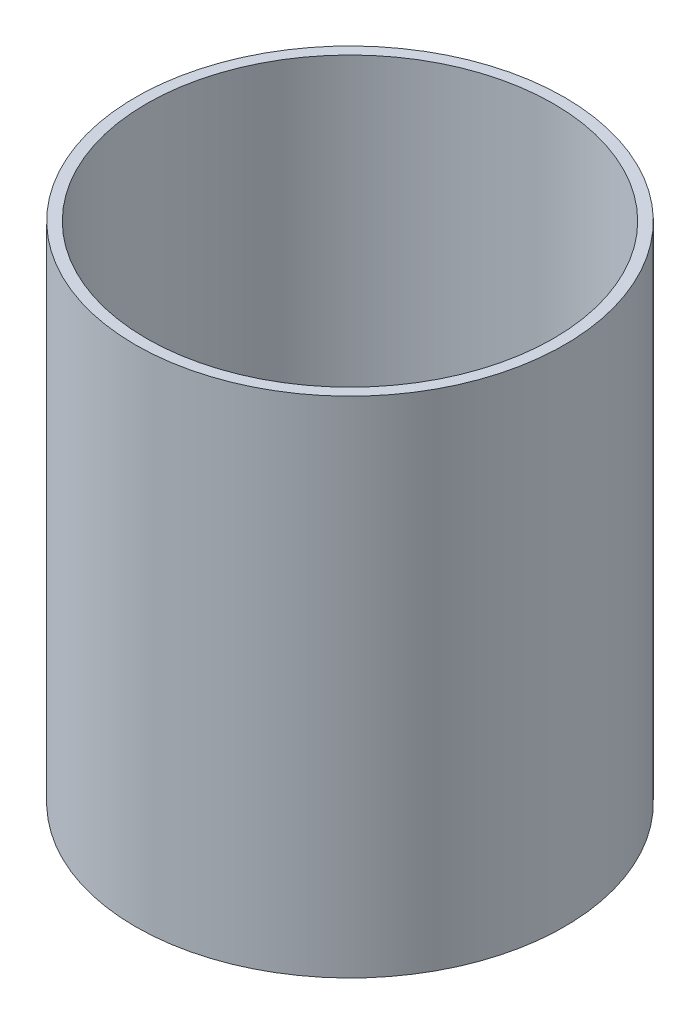
ISO-10303-21;
HEADER;
FILE_DESCRIPTION(('STEP AP214'),'2;1');
FILE_NAME('part.step','',(''),(''),'','','');
FILE_SCHEMA(('AUTOMOTIVE_DESIGN { 1 0 10303 214 1 1 1 1 }'));
ENDSEC;
DATA;
#1=APPLICATION_CONTEXT('core data for automotive mechanical design processes');
#2=APPLICATION_PROTOCOL_DEFINITION('international standard','automotive_design',2000,#1);
#3=PRODUCT_CONTEXT('',#1,'mechanical');
#4=PRODUCT('Part','Part','',(#3));
#5=PRODUCT_RELATED_PRODUCT_CATEGORY('part','',(#4));
#6=PRODUCT_DEFINITION_FORMATION('','',#4);
#7=PRODUCT_DEFINITION_CONTEXT('part definition',#1,'design');
#8=PRODUCT_DEFINITION('design','',#6,#7);
#9=PRODUCT_DEFINITION_SHAPE('','',#8);
#10=(LENGTH_UNIT() NAMED_UNIT(*) SI_UNIT(.MILLI.,.METRE.));
#11=(NAMED_UNIT(*) PLANE_ANGLE_UNIT() SI_UNIT($,.RADIAN.));
#12=(NAMED_UNIT(*) SI_UNIT($,.STERADIAN.) SOLID_ANGLE_UNIT());
#13=UNCERTAINTY_MEASURE_WITH_UNIT(LENGTH_MEASURE(1.E-05),#10,'distance_accuracy_value','');
#14=(GEOMETRIC_REPRESENTATION_CONTEXT(3) GLOBAL_UNCERTAINTY_ASSIGNED_CONTEXT((#13)) GLOBAL_UNIT_ASSIGNED_CONTEXT((#10,
#11,#12)) REPRESENTATION_CONTEXT('',''));
#15=CARTESIAN_POINT('',(0.,0.,0.));
#16=DIRECTION('',(0.,0.,1.));
#17=DIRECTION('',(1.,0.,0.));
#18=AXIS2_PLACEMENT_3D('',#15,#16,#17);
#19=CARTESIAN_POINT('',(114.506948172919,-184.97484112834,-22.0425890832619));
#20=DIRECTION('',(0.,1.,0.));
#21=DIRECTION('',(0.,0.,1.));
#22=AXIS2_PLACEMENT_3D('',#19,#20,#21);
#23=CYLINDRICAL_SURFACE('',#22,8.00099999999994);
#24=CARTESIAN_POINT('',(114.506948172919,-166.17884112834,-22.0425890832619));
#25=DIRECTION('',(0.,1.,0.));
#26=DIRECTION('',(0.,0.,1.));
#27=AXIS2_PLACEMENT_3D('',#24,#25,#26);
#28=CIRCLE('',#27,8.00099999999994);
#29=CARTESIAN_POINT('',(114.506948172919,-166.17884112834,-14.0415890832619));
#30=VERTEX_POINT('',#29);
#31=EDGE_CURVE('E19',#30,#30,#28,.T.);
#32=ORIENTED_EDGE('',*,*,#31,.F.);
#33=EDGE_LOOP('',(#32));
#34=FACE_BOUND('',#33,.T.);
#35=CARTESIAN_POINT('',(114.506948172919,-184.97484112834,-22.0425890832619));
#36=DIRECTION('',(0.,1.,0.));
#37=DIRECTION('',(0.,0.,1.));
#38=AXIS2_PLACEMENT_3D('',#35,#36,#37);
#39=CIRCLE('',#38,8.00099999999994);
#40=CARTESIAN_POINT('',(114.506948172919,-184.97484112834,-14.0415890832619));
#41=VERTEX_POINT('',#40);
#42=EDGE_CURVE('E28',#41,#41,#39,.F.);
#43=ORIENTED_EDGE('',*,*,#42,.F.);
#44=EDGE_LOOP('',(#43));
#45=FACE_BOUND('',#44,.T.);
#46=ADVANCED_FACE('F15',(#34,#45),#23,.T.);
#47=CARTESIAN_POINT('',(122.533348172919,-166.17884112834,-30.0689890832617));
#48=DIRECTION('',(0.,1.,0.));
#49=DIRECTION('',(-1.,0.,0.));
#50=AXIS2_PLACEMENT_3D('',#47,#48,#49);
#51=PLANE('',#50);
#52=CARTESIAN_POINT('',(114.506948172919,-166.17884112834,-22.0425890832619));
#53=DIRECTION('',(0.,-1.,0.));
#54=DIRECTION('',(0.,0.,-1.));
#55=AXIS2_PLACEMENT_3D('',#52,#53,#54);
#56=CIRCLE('',#55,7.58920613932462);
#57=CARTESIAN_POINT('',(114.506948172919,-166.17884112834,-29.6317952225865));
#58=VERTEX_POINT('',#57);
#59=EDGE_CURVE('E23',#58,#58,#56,.F.);
#60=ORIENTED_EDGE('',*,*,#59,.F.);
#61=EDGE_LOOP('',(#60));
#62=FACE_BOUND('',#61,.T.);
#63=ORIENTED_EDGE('',*,*,#31,.T.);
#64=EDGE_LOOP('',(#63));
#65=FACE_BOUND('',#64,.T.);
#66=ADVANCED_FACE('F36',(#62,#65),#51,.T.);
#67=CARTESIAN_POINT('',(106.480548172919,-184.97484112834,-30.0689890832617));
#68=DIRECTION('',(0.,-1.,0.));
#69=DIRECTION('',(1.,0.,0.));
#70=AXIS2_PLACEMENT_3D('',#67,#68,#69);
#71=PLANE('',#70);
#72=CARTESIAN_POINT('',(114.506948172919,-184.97484112834,-22.0425890832619));
#73=DIRECTION('',(0.,-1.,0.));
#74=DIRECTION('',(0.,0.,-1.));
#75=AXIS2_PLACEMENT_3D('',#72,#73,#74);
#76=CIRCLE('',#75,7.58920613932462);
#77=CARTESIAN_POINT('',(114.506948172919,-184.97484112834,-29.6317952225865));
#78=VERTEX_POINT('',#77);
#79=EDGE_CURVE('E10',#78,#78,#76,.T.);
#80=ORIENTED_EDGE('',*,*,#79,.F.);
#81=EDGE_LOOP('',(#80));
#82=FACE_BOUND('',#81,.T.);
#83=ORIENTED_EDGE('',*,*,#42,.T.);
#84=EDGE_LOOP('',(#83));
#85=FACE_BOUND('',#84,.T.);
#86=ADVANCED_FACE('F45',(#82,#85),#71,.T.);
#87=CARTESIAN_POINT('',(114.506948172919,-166.17884112834,-22.0425890832619));
#88=DIRECTION('',(0.,-1.,0.));
#89=DIRECTION('',(0.,0.,-1.));
#90=AXIS2_PLACEMENT_3D('',#87,#88,#89);
#91=CYLINDRICAL_SURFACE('',#90,7.58920613932462);
#92=ORIENTED_EDGE('',*,*,#79,.T.);
#93=EDGE_LOOP('',(#92));
#94=FACE_BOUND('',#93,.T.);
#95=ORIENTED_EDGE('',*,*,#59,.T.);
#96=EDGE_LOOP('',(#95));
#97=FACE_BOUND('',#96,.T.);
#98=ADVANCED_FACE('F17',(#94,#97),#91,.F.);
#99=CLOSED_SHELL('',(#46,#66,#86,#98));
#100=MANIFOLD_SOLID_BREP('B1',#99);
#101=ADVANCED_BREP_SHAPE_REPRESENTATION('',(#18,#100),#14);
#102=SHAPE_DEFINITION_REPRESENTATION(#9,#101);
ENDSEC;
END-ISO-10303-21;
